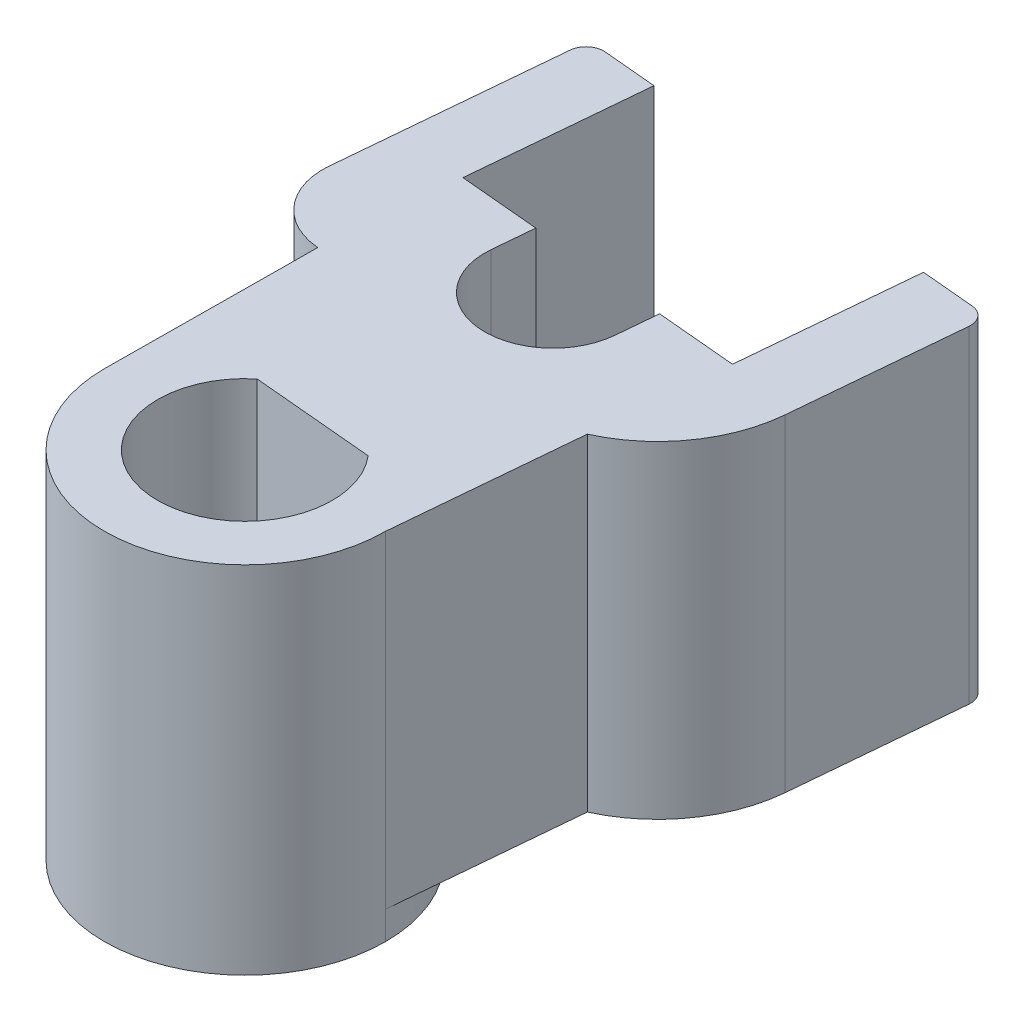
ISO-10303-21;
HEADER;
FILE_DESCRIPTION(('STEP AP214'),'2;1');
FILE_NAME('part.step','',(''),(''),'','','');
FILE_SCHEMA(('AUTOMOTIVE_DESIGN { 1 0 10303 214 1 1 1 1 }'));
ENDSEC;
DATA;
#1=APPLICATION_CONTEXT('core data for automotive mechanical design processes');
#2=APPLICATION_PROTOCOL_DEFINITION('international standard','automotive_design',2000,#1);
#3=PRODUCT_CONTEXT('',#1,'mechanical');
#4=PRODUCT('Part','Part','',(#3));
#5=PRODUCT_RELATED_PRODUCT_CATEGORY('part','',(#4));
#6=PRODUCT_DEFINITION_FORMATION('','',#4);
#7=PRODUCT_DEFINITION_CONTEXT('part definition',#1,'design');
#8=PRODUCT_DEFINITION('design','',#6,#7);
#9=PRODUCT_DEFINITION_SHAPE('','',#8);
#10=(LENGTH_UNIT() NAMED_UNIT(*) SI_UNIT(.MILLI.,.METRE.));
#11=(NAMED_UNIT(*) PLANE_ANGLE_UNIT() SI_UNIT($,.RADIAN.));
#12=(NAMED_UNIT(*) SI_UNIT($,.STERADIAN.) SOLID_ANGLE_UNIT());
#13=UNCERTAINTY_MEASURE_WITH_UNIT(LENGTH_MEASURE(1.E-05),#10,'distance_accuracy_value','');
#14=(GEOMETRIC_REPRESENTATION_CONTEXT(3) GLOBAL_UNCERTAINTY_ASSIGNED_CONTEXT((#13)) GLOBAL_UNIT_ASSIGNED_CONTEXT((#10,
#11,#12)) REPRESENTATION_CONTEXT('',''));
#15=CARTESIAN_POINT('',(0.,0.,0.));
#16=DIRECTION('',(0.,0.,1.));
#17=DIRECTION('',(1.,0.,0.));
#18=AXIS2_PLACEMENT_3D('',#15,#16,#17);
#19=CARTESIAN_POINT('',(0.,0.,0.));
#20=DIRECTION('',(0.,1.,0.));
#21=DIRECTION('',(1.,0.,0.));
#22=AXIS2_PLACEMENT_3D('',#19,#20,#21);
#23=PLANE('',#22);
#24=CARTESIAN_POINT('',(0.,0.,0.));
#25=DIRECTION('',(0.,1.,0.));
#26=DIRECTION('',(-1.,0.,0.));
#27=AXIS2_PLACEMENT_3D('',#24,#25,#26);
#28=CIRCLE('',#27,20.);
#29=CARTESIAN_POINT('',(-20.,0.,0.));
#30=VERTEX_POINT('',#29);
#31=CARTESIAN_POINT('',(20.,0.,0.));
#32=VERTEX_POINT('',#31);
#33=EDGE_CURVE('E62',#30,#32,#28,.T.);
#34=ORIENTED_EDGE('',*,*,#33,.F.);
#35=CARTESIAN_POINT('',(0.,0.,0.));
#36=DIRECTION('',(0.,1.,0.));
#37=DIRECTION('',(1.,0.,0.));
#38=AXIS2_PLACEMENT_3D('',#35,#36,#37);
#39=CIRCLE('',#38,20.);
#40=EDGE_CURVE('E50',#32,#30,#39,.T.);
#41=ORIENTED_EDGE('',*,*,#40,.F.);
#42=EDGE_LOOP('',(#34,#41));
#43=FACE_BOUND('',#42,.T.);
#44=CARTESIAN_POINT('',(0.,0.,0.));
#45=DIRECTION('',(0.,-1.,0.));
#46=DIRECTION('',(0.762382224828731,0.,-0.647126991606126));
#47=AXIS2_PLACEMENT_3D('',#44,#45,#46);
#48=CIRCLE('',#47,12.425);
#49=CARTESIAN_POINT('',(9.472599143497,0.,-8.040552870706));
#50=VERTEX_POINT('',#49);
#51=CARTESIAN_POINT('',(-7.874008605289,0.,-9.611483417446));
#52=VERTEX_POINT('',#51);
#53=EDGE_CURVE('E322',#50,#52,#48,.T.);
#54=ORIENTED_EDGE('',*,*,#53,.F.);
#55=DIRECTION('',(0.995924381742855,0.,0.0901921606910059));
#56=VECTOR('',#55,1.);
#57=CARTESIAN_POINT('',(-7.874008605289,0.,-9.611483417446));
#58=LINE('',#57,#56);
#59=EDGE_CURVE('E333',#52,#50,#58,.T.);
#60=ORIENTED_EDGE('',*,*,#59,.F.);
#61=EDGE_LOOP('',(#54,#60));
#62=FACE_BOUND('',#61,.T.);
#63=ADVANCED_FACE('F39',(#43,#62),#23,.F.);
#64=CARTESIAN_POINT('',(0.,0.,0.));
#65=DIRECTION('',(0.,1.,0.));
#66=DIRECTION('',(1.,0.,0.));
#67=AXIS2_PLACEMENT_3D('',#64,#65,#66);
#68=CYLINDRICAL_SURFACE('',#67,20.);
#69=DIRECTION('',(-1.42108547152E-12,1.,1.509903313491E-11));
#70=VECTOR('',#69,1.);
#71=CARTESIAN_POINT('',(-19.67846218499,3.99,-3.571851905383));
#72=LINE('',#71,#70);
#73=CARTESIAN_POINT('',(-19.67846218499,3.99,-3.571851905383));
#74=VERTEX_POINT('',#73);
#75=CARTESIAN_POINT('',(-19.67846218499,4.,-3.571851905382));
#76=VERTEX_POINT('',#75);
#77=EDGE_CURVE('E11',#74,#76,#72,.T.);
#78=ORIENTED_EDGE('',*,*,#77,.T.);
#79=CARTESIAN_POINT('',(0.,4.,0.));
#80=DIRECTION('',(0.,1.,0.));
#81=DIRECTION('',(1.,0.,0.));
#82=AXIS2_PLACEMENT_3D('',#79,#80,#81);
#83=CIRCLE('',#82,20.);
#84=CARTESIAN_POINT('',(20.,4.,0.));
#85=VERTEX_POINT('',#84);
#86=EDGE_CURVE('E378',#85,#76,#83,.T.);
#87=ORIENTED_EDGE('',*,*,#86,.F.);
#88=DIRECTION('',(0.,1.,0.));
#89=VECTOR('',#88,1.);
#90=CARTESIAN_POINT('',(20.,0.,0.));
#91=LINE('',#90,#89);
#92=EDGE_CURVE('E296',#32,#85,#91,.T.);
#93=ORIENTED_EDGE('',*,*,#92,.F.);
#94=ORIENTED_EDGE('',*,*,#40,.T.);
#95=DIRECTION('',(0.,1.,0.));
#96=VECTOR('',#95,1.);
#97=CARTESIAN_POINT('',(-20.,0.,0.));
#98=LINE('',#97,#96);
#99=CARTESIAN_POINT('',(-20.,50.52,0.));
#100=VERTEX_POINT('',#99);
#101=EDGE_CURVE('E271',#30,#100,#98,.T.);
#102=ORIENTED_EDGE('',*,*,#101,.T.);
#103=CARTESIAN_POINT('',(0.,50.52,0.));
#104=DIRECTION('',(0.,1.,0.));
#105=DIRECTION('',(-0.999859265535129,0.,-0.0167764454981105));
#106=AXIS2_PLACEMENT_3D('',#103,#104,#105);
#107=CIRCLE('',#106,20.);
#108=CARTESIAN_POINT('',(-19.9971853107,50.52,-0.3355289099625));
#109=VERTEX_POINT('',#108);
#110=EDGE_CURVE('E437',#109,#100,#107,.T.);
#111=ORIENTED_EDGE('',*,*,#110,.F.);
#112=DIRECTION('',(0.,1.,0.));
#113=VECTOR('',#112,1.);
#114=CARTESIAN_POINT('',(-19.9971853107,3.99,-0.3355289099629));
#115=LINE('',#114,#113);
#116=CARTESIAN_POINT('',(-19.9971853107,3.99,-0.335528909964));
#117=VERTEX_POINT('',#116);
#118=EDGE_CURVE('E206',#117,#109,#115,.T.);
#119=ORIENTED_EDGE('',*,*,#118,.F.);
#120=CARTESIAN_POINT('',(0.,3.99,0.));
#121=DIRECTION('',(0.,1.,0.));
#122=DIRECTION('',(-0.98392310924942,0.,-0.178592595269104));
#123=AXIS2_PLACEMENT_3D('',#120,#121,#122);
#124=CIRCLE('',#123,20.);
#125=EDGE_CURVE('E199',#74,#117,#124,.T.);
#126=ORIENTED_EDGE('',*,*,#125,.F.);
#127=EDGE_LOOP('',(#78,#87,#93,#94,#102,#111,#119,#126));
#128=FACE_BOUND('',#127,.T.);
#129=ADVANCED_FACE('F504',(#128),#68,.T.);
#130=CARTESIAN_POINT('',(0.,3.99,0.));
#131=DIRECTION('',(0.,1.,0.));
#132=DIRECTION('',(1.,0.,0.));
#133=AXIS2_PLACEMENT_3D('',#130,#131,#132);
#134=PLANE('',#133);
#135=DIRECTION('',(0.0896573776958166,0.,-0.995972667609262));
#136=VECTOR('',#135,1.);
#137=CARTESIAN_POINT('',(-19.67846218499,3.99,-3.571851905383));
#138=LINE('',#137,#136);
#139=CARTESIAN_POINT('',(-15.60744357538,3.99,-48.79538362913));
#140=VERTEX_POINT('',#139);
#141=EDGE_CURVE('E278',#74,#140,#138,.T.);
#142=ORIENTED_EDGE('',*,*,#141,.F.);
#143=ORIENTED_EDGE('',*,*,#125,.T.);
#144=DIRECTION('',(-0.00838851789265115,0.,0.999964815764817));
#145=VECTOR('',#144,1.);
#146=CARTESIAN_POINT('',(-19.74752595585,3.99,-30.09651577054));
#147=LINE('',#146,#145);
#148=CARTESIAN_POINT('',(-19.74752595585,3.99,-30.09651577054));
#149=VERTEX_POINT('',#148);
#150=EDGE_CURVE('E289',#149,#117,#147,.T.);
#151=ORIENTED_EDGE('',*,*,#150,.F.);
#152=DIRECTION('',(0.0901921606910059,0.,-0.995924381742855));
#153=VECTOR('',#152,1.);
#154=CARTESIAN_POINT('',(-19.74752595585,3.99,-30.09651577054));
#155=LINE('',#154,#153);
#156=CARTESIAN_POINT('',(-18.03423013476,3.99,-49.01515646263));
#157=VERTEX_POINT('',#156);
#158=EDGE_CURVE('E340',#149,#157,#155,.T.);
#159=ORIENTED_EDGE('',*,*,#158,.T.);
#160=DIRECTION('',(0.995924381742854,0.,0.0901921606910158));
#161=VECTOR('',#160,1.);
#162=CARTESIAN_POINT('',(-18.03423013476,3.99,-49.01515646263));
#163=LINE('',#162,#161);
#164=EDGE_CURVE('E344',#157,#140,#163,.T.);
#165=ORIENTED_EDGE('',*,*,#164,.T.);
#166=EDGE_LOOP('',(#142,#143,#151,#159,#165));
#167=FACE_BOUND('',#166,.T.);
#168=ADVANCED_FACE('F604',(#167),#134,.F.);
#169=CARTESIAN_POINT('',(-19.58764088762,200.52,-49.15583528806));
#170=DIRECTION('',(-0.0901921606910059,0.,0.995924381742855));
#171=DIRECTION('',(0.,1.,0.));
#172=AXIS2_PLACEMENT_3D('',#169,#170,#171);
#173=PLANE('',#172);
#174=DIRECTION('',(0.995924381742855,0.,0.0901921606910059));
#175=VECTOR('',#174,1.);
#176=CARTESIAN_POINT('',(-18.03423013476,50.52,-49.01515646263));
#177=LINE('',#176,#175);
#178=CARTESIAN_POINT('',(-18.03423013476,50.52,-49.01515646263));
#179=VERTEX_POINT('',#178);
#180=CARTESIAN_POINT('',(-6.645483010103,50.52,-47.98377724392));
#181=VERTEX_POINT('',#180);
#182=EDGE_CURVE('E287',#179,#181,#177,.T.);
#183=ORIENTED_EDGE('',*,*,#182,.T.);
#184=DIRECTION('',(0.,-1.,0.));
#185=VECTOR('',#184,1.);
#186=CARTESIAN_POINT('',(-6.645483010103,50.52,-47.98377724392));
#187=LINE('',#186,#185);
#188=CARTESIAN_POINT('',(-6.645483010103,4.,-47.98377724392));
#189=VERTEX_POINT('',#188);
#190=EDGE_CURVE('E283',#181,#189,#187,.T.);
#191=ORIENTED_EDGE('',*,*,#190,.T.);
#192=DIRECTION('',(0.995924381742855,0.,0.0901921606910059));
#193=VECTOR('',#192,1.);
#194=CARTESIAN_POINT('',(-15.60744357538,4.,-48.79538362913));
#195=LINE('',#194,#193);
#196=CARTESIAN_POINT('',(-15.60744357538,4.,-48.79538362913));
#197=VERTEX_POINT('',#196);
#198=EDGE_CURVE('E421',#197,#189,#195,.T.);
#199=ORIENTED_EDGE('',*,*,#198,.F.);
#200=DIRECTION('',(0.,-1.,0.));
#201=VECTOR('',#200,1.);
#202=CARTESIAN_POINT('',(-15.60744357538,4.,-48.79538362913));
#203=LINE('',#202,#201);
#204=EDGE_CURVE('E288',#197,#140,#203,.T.);
#205=ORIENTED_EDGE('',*,*,#204,.T.);
#206=ORIENTED_EDGE('',*,*,#164,.F.);
#207=DIRECTION('',(0.,-1.,0.));
#208=VECTOR('',#207,1.);
#209=CARTESIAN_POINT('',(-18.03423013476,4.,-49.01515646263));
#210=LINE('',#209,#208);
#211=CARTESIAN_POINT('',(-18.03423013476,4.,-49.01515646263));
#212=VERTEX_POINT('',#211);
#213=EDGE_CURVE('E353',#212,#157,#210,.T.);
#214=ORIENTED_EDGE('',*,*,#213,.F.);
#215=DIRECTION('',(0.,-1.,0.));
#216=VECTOR('',#215,1.);
#217=CARTESIAN_POINT('',(-18.03423013476,50.52,-49.01515646263));
#218=LINE('',#217,#216);
#219=EDGE_CURVE('E345',#179,#212,#218,.T.);
#220=ORIENTED_EDGE('',*,*,#219,.F.);
#221=EDGE_LOOP('',(#183,#191,#199,#205,#206,#214,#220));
#222=FACE_BOUND('',#221,.T.);
#223=ADVANCED_FACE('F636',(#222),#173,.F.);
#224=CARTESIAN_POINT('',(-19.58764088762,200.52,-49.15583528806));
#225=DIRECTION('',(-0.0901921606910059,0.,0.995924381742855));
#226=DIRECTION('',(0.,1.,0.));
#227=AXIS2_PLACEMENT_3D('',#224,#225,#226);
#228=PLANE('',#227);
#229=DIRECTION('',(0.995924381742855,0.,0.0901921606910059));
#230=VECTOR('',#229,1.);
#231=CARTESIAN_POINT('',(12.7046240883,4.,-46.23140728411));
#232=LINE('',#231,#230);
#233=CARTESIAN_POINT('',(12.7046240883,4.,-46.23140728411));
#234=VERTEX_POINT('',#233);
#235=CARTESIAN_POINT('',(24.09337121296,4.,-45.2000280654));
#236=VERTEX_POINT('',#235);
#237=EDGE_CURVE('E247',#234,#236,#232,.T.);
#238=ORIENTED_EDGE('',*,*,#237,.F.);
#239=DIRECTION('',(0.,-1.,0.));
#240=VECTOR('',#239,1.);
#241=CARTESIAN_POINT('',(12.7046240883,50.52,-46.23140728411));
#242=LINE('',#241,#240);
#243=CARTESIAN_POINT('',(12.7046240883,50.52,-46.23140728411));
#244=VERTEX_POINT('',#243);
#245=EDGE_CURVE('E232',#244,#234,#242,.T.);
#246=ORIENTED_EDGE('',*,*,#245,.F.);
#247=DIRECTION('',(0.995924381742855,0.,0.0901921606910059));
#248=VECTOR('',#247,1.);
#249=CARTESIAN_POINT('',(12.7046240883,50.52,-46.23140728411));
#250=LINE('',#249,#248);
#251=CARTESIAN_POINT('',(24.09337121296,50.52,-45.2000280654));
#252=VERTEX_POINT('',#251);
#253=EDGE_CURVE('E381',#244,#252,#250,.T.);
#254=ORIENTED_EDGE('',*,*,#253,.T.);
#255=DIRECTION('',(0.,-1.,0.));
#256=VECTOR('',#255,1.);
#257=CARTESIAN_POINT('',(24.09337121296,50.52,-45.2000280654));
#258=LINE('',#257,#256);
#259=EDGE_CURVE('E249',#252,#236,#258,.T.);
#260=ORIENTED_EDGE('',*,*,#259,.T.);
#261=EDGE_LOOP('',(#238,#246,#254,#260));
#262=FACE_BOUND('',#261,.T.);
#263=ADVANCED_FACE('F248',(#262),#228,.F.);
#264=CARTESIAN_POINT('',(-16.30073077987,4.,-68.15688962486));
#265=DIRECTION('',(0.995924381742855,0.,0.0901921606910059));
#266=DIRECTION('',(0.,-1.,0.));
#267=AXIS2_PLACEMENT_3D('',#264,#265,#266);
#268=PLANE('',#267);
#269=DIRECTION('',(-0.0901921606910059,0.,0.995924381742855));
#270=VECTOR('',#269,1.);
#271=CARTESIAN_POINT('',(-16.30073077987,4.,-68.15688962486));
#272=LINE('',#271,#270);
#273=CARTESIAN_POINT('',(-15.7794261174871,4.,-73.9132660062016));
#274=VERTEX_POINT('',#273);
#275=EDGE_CURVE('E362',#274,#212,#272,.T.);
#276=ORIENTED_EDGE('',*,*,#275,.F.);
#277=DIRECTION('',(0.,-1.,0.));
#278=VECTOR('',#277,1.);
#279=CARTESIAN_POINT('',(-15.7794261174871,79.0492360361072,-73.9132660062016));
#280=LINE('',#279,#278);
#281=CARTESIAN_POINT('',(-15.7794261174871,50.52,-73.9132660062016));
#282=VERTEX_POINT('',#281);
#283=EDGE_CURVE('E282',#282,#274,#280,.T.);
#284=ORIENTED_EDGE('',*,*,#283,.F.);
#285=DIRECTION('',(-0.0901921606910059,0.,0.995924381742855));
#286=VECTOR('',#285,1.);
#287=CARTESIAN_POINT('',(-16.30073077987,50.52,-68.15688962486));
#288=LINE('',#287,#286);
#289=EDGE_CURVE('E348',#282,#179,#288,.T.);
#290=ORIENTED_EDGE('',*,*,#289,.T.);
#291=ORIENTED_EDGE('',*,*,#219,.T.);
#292=EDGE_LOOP('',(#276,#284,#290,#291));
#293=FACE_BOUND('',#292,.T.);
#294=ADVANCED_FACE('F615',(#293),#268,.T.);
#295=CARTESIAN_POINT('',(0.,50.52,0.));
#296=DIRECTION('',(0.,1.,0.));
#297=DIRECTION('',(1.,0.,0.));
#298=AXIS2_PLACEMENT_3D('',#295,#296,#297);
#299=PLANE('',#298);
#300=CARTESIAN_POINT('',(14.14012742753,50.52,-44.50508780831));
#301=DIRECTION('',(0.,1.,0.));
#302=DIRECTION('',(0.411997398217113,0.,0.911185021750429));
#303=AXIS2_PLACEMENT_3D('',#300,#301,#302);
#304=CIRCLE('',#303,20.);
#305=CARTESIAN_POINT('',(22.38007539188,50.52,-26.28138737331));
#306=VERTEX_POINT('',#305);
#307=CARTESIAN_POINT('',(34.05861506239,50.52,-42.70124459449));
#308=VERTEX_POINT('',#307);
#309=EDGE_CURVE('E415',#306,#308,#304,.T.);
#310=ORIENTED_EDGE('',*,*,#309,.T.);
#311=DIRECTION('',(-0.0901921606910059,0.,0.995924381742855));
#312=VECTOR('',#311,1.);
#313=CARTESIAN_POINT('',(35.25906183736,50.52,-55.95687793355));
#314=LINE('',#313,#312);
#315=CARTESIAN_POINT('',(36.2313273031977,50.52,-66.6928762236008));
#316=VERTEX_POINT('',#315);
#317=EDGE_CURVE('E43',#316,#308,#314,.T.);
#318=ORIENTED_EDGE('',*,*,#317,.F.);
#319=CARTESIAN_POINT('',(33.7415163488405,50.52,-66.9183566253282));
#320=DIRECTION('',(0.,1.,0.));
#321=DIRECTION('',(0.,0.,1.));
#322=AXIS2_PLACEMENT_3D('',#319,#320,#321);
#323=CIRCLE('',#322,2.5);
#324=CARTESIAN_POINT('',(33.966996750568,50.52,-69.4081675796854));
#325=VERTEX_POINT('',#324);
#326=EDGE_CURVE('E548',#325,#316,#323,.F.);
#327=ORIENTED_EDGE('',*,*,#326,.F.);
#328=DIRECTION('',(0.995924381742857,0.,0.0901921606909796));
#329=VECTOR('',#328,1.);
#330=CARTESIAN_POINT('',(26.3481752302329,50.52,-70.0981376089716));
#331=LINE('',#330,#329);
#332=CARTESIAN_POINT('',(26.3481752302329,50.52,-70.0981376089716));
#333=VERTEX_POINT('',#332);
#334=EDGE_CURVE('E543',#333,#325,#331,.T.);
#335=ORIENTED_EDGE('',*,*,#334,.F.);
#336=DIRECTION('',(0.0901921606910059,0.,-0.995924381742855));
#337=VECTOR('',#336,1.);
#338=CARTESIAN_POINT('',(24.09337121296,50.52,-45.2000280654));
#339=LINE('',#338,#337);
#340=EDGE_CURVE('E405',#252,#333,#339,.T.);
#341=ORIENTED_EDGE('',*,*,#340,.F.);
#342=ORIENTED_EDGE('',*,*,#253,.F.);
#343=DIRECTION('',(0.0901921606910059,0.,-0.995924381742855));
#344=VECTOR('',#343,1.);
#345=CARTESIAN_POINT('',(12.17758191751,50.52,-40.41167590085));
#346=LINE('',#345,#344);
#347=CARTESIAN_POINT('',(12.17758191751,50.52,-40.41167590085));
#348=VERTEX_POINT('',#347);
#349=EDGE_CURVE('E239',#348,#244,#346,.T.);
#350=ORIENTED_EDGE('',*,*,#349,.F.);
#351=CARTESIAN_POINT('',(2.502528368309,50.52,-41.28786088076));
#352=DIRECTION('',(0.,1.,0.));
#353=DIRECTION('',(-0.995924381742854,0.,-0.0901921606910158));
#354=AXIS2_PLACEMENT_3D('',#351,#352,#353);
#355=CIRCLE('',#354,9.714646740822);
#356=CARTESIAN_POINT('',(-7.172525180893,50.52,-42.16404586066));
#357=VERTEX_POINT('',#356);
#358=EDGE_CURVE('E160',#357,#348,#355,.T.);
#359=ORIENTED_EDGE('',*,*,#358,.F.);
#360=DIRECTION('',(-0.0901921606910059,0.,0.995924381742855));
#361=VECTOR('',#360,1.);
#362=CARTESIAN_POINT('',(-6.645483010103,50.52,-47.98377724392));
#363=LINE('',#362,#361);
#364=EDGE_CURVE('E172',#181,#357,#363,.T.);
#365=ORIENTED_EDGE('',*,*,#364,.F.);
#366=ORIENTED_EDGE('',*,*,#182,.F.);
#367=ORIENTED_EDGE('',*,*,#289,.F.);
#368=DIRECTION('',(0.995924381742863,0.,0.0901921606909153));
#369=VECTOR('',#368,1.);
#370=CARTESIAN_POINT('',(-15.7794261174871,50.52,-73.9132660062016));
#371=LINE('',#370,#369);
#372=CARTESIAN_POINT('',(-23.4028511523983,50.52,-74.6036529355391));
#373=VERTEX_POINT('',#372);
#374=EDGE_CURVE('E529',#373,#282,#371,.T.);
#375=ORIENTED_EDGE('',*,*,#374,.F.);
#376=CARTESIAN_POINT('',(-23.6283315541256,50.52,-72.113841981182));
#377=DIRECTION('',(0.,1.,0.));
#378=DIRECTION('',(0.,0.,1.));
#379=AXIS2_PLACEMENT_3D('',#376,#377,#378);
#380=CIRCLE('',#379,2.5);
#381=CARTESIAN_POINT('',(-26.1181425084827,50.52,-72.3393223829091));
#382=VERTEX_POINT('',#381);
#383=EDGE_CURVE('E524',#382,#373,#380,.F.);
#384=ORIENTED_EDGE('',*,*,#383,.F.);
#385=DIRECTION('',(-0.0901921606910059,0.,0.995924381742855));
#386=VECTOR('',#385,1.);
#387=CARTESIAN_POINT('',(-27.09040797432,50.52,-61.60332409286));
#388=LINE('',#387,#386);
#389=CARTESIAN_POINT('',(-28.9588403382,50.52,-40.97162691903));
#390=VERTEX_POINT('',#389);
#391=EDGE_CURVE('E325',#382,#390,#388,.T.);
#392=ORIENTED_EDGE('',*,*,#391,.T.);
#393=CARTESIAN_POINT('',(-18.99959652078,50.52,-40.06970531212));
#394=DIRECTION('',(0.,1.,0.));
#395=DIRECTION('',(-0.995924381742855,0.,-0.0901921606910059));
#396=AXIS2_PLACEMENT_3D('',#393,#394,#395);
#397=CIRCLE('',#396,10.);
#398=CARTESIAN_POINT('',(-19.90151812769,50.52,-30.11046149469));
#399=VERTEX_POINT('',#398);
#400=EDGE_CURVE('E276',#390,#399,#397,.T.);
#401=ORIENTED_EDGE('',*,*,#400,.T.);
#402=DIRECTION('',(-0.995924381742854,0.,-0.0901921606910158));
#403=VECTOR('',#402,1.);
#404=CARTESIAN_POINT('',(-19.74752595585,50.52,-30.09651577054));
#405=LINE('',#404,#403);
#406=CARTESIAN_POINT('',(-19.74752595585,50.52,-30.09651577054));
#407=VERTEX_POINT('',#406);
#408=EDGE_CURVE('E409',#407,#399,#405,.T.);
#409=ORIENTED_EDGE('',*,*,#408,.F.);
#410=DIRECTION('',(-0.00838851789265115,0.,0.999964815764817));
#411=VECTOR('',#410,1.);
#412=CARTESIAN_POINT('',(-19.74752595585,50.52,-30.09651577054));
#413=LINE('',#412,#411);
#414=EDGE_CURVE('E349',#407,#109,#413,.T.);
#415=ORIENTED_EDGE('',*,*,#414,.T.);
#416=ORIENTED_EDGE('',*,*,#110,.T.);
#417=CARTESIAN_POINT('',(0.,50.52,0.));
#418=DIRECTION('',(0.,1.,0.));
#419=DIRECTION('',(-1.,0.,0.));
#420=AXIS2_PLACEMENT_3D('',#417,#418,#419);
#421=CIRCLE('',#420,20.);
#422=CARTESIAN_POINT('',(20.,50.52,0.));
#423=VERTEX_POINT('',#422);
#424=EDGE_CURVE('E427',#100,#423,#421,.T.);
#425=ORIENTED_EDGE('',*,*,#424,.T.);
#426=DIRECTION('',(-0.0901921606910059,0.,0.995924381742855));
#427=VECTOR('',#426,1.);
#428=CARTESIAN_POINT('',(22.38007539188,50.52,-26.28138737331));
#429=LINE('',#428,#427);
#430=EDGE_CURVE('E402',#306,#423,#429,.T.);
#431=ORIENTED_EDGE('',*,*,#430,.F.);
#432=EDGE_LOOP('',(#310,#318,#327,#335,#341,#342,#350,#359,#365,#366,#367,#375,#384,#392,#401,
#409,#415,#416,#425,#431));
#433=FACE_BOUND('',#432,.T.);
#434=CARTESIAN_POINT('',(0.,50.52,0.));
#435=DIRECTION('',(0.,-1.,0.));
#436=DIRECTION('',(0.762382224828731,0.,-0.647126991606126));
#437=AXIS2_PLACEMENT_3D('',#434,#435,#436);
#438=CIRCLE('',#437,12.425);
#439=CARTESIAN_POINT('',(9.472599143497,50.52,-8.040552870706));
#440=VERTEX_POINT('',#439);
#441=CARTESIAN_POINT('',(-7.874008605289,50.52,-9.611483417446));
#442=VERTEX_POINT('',#441);
#443=EDGE_CURVE('E272',#440,#442,#438,.T.);
#444=ORIENTED_EDGE('',*,*,#443,.T.);
#445=DIRECTION('',(0.995924381742855,0.,0.0901921606910059));
#446=VECTOR('',#445,1.);
#447=CARTESIAN_POINT('',(-7.874008605289,50.52,-9.611483417446));
#448=LINE('',#447,#446);
#449=EDGE_CURVE('E277',#442,#440,#448,.T.);
#450=ORIENTED_EDGE('',*,*,#449,.T.);
#451=EDGE_LOOP('',(#444,#450));
#452=FACE_BOUND('',#451,.T.);
#453=ADVANCED_FACE('F489',(#433,#452),#299,.T.);
#454=CARTESIAN_POINT('',(-7.874008605289,0.,-9.611483417446));
#455=DIRECTION('',(-0.0901921606910059,0.,0.995924381742855));
#456=DIRECTION('',(0.,1.,0.));
#457=AXIS2_PLACEMENT_3D('',#454,#455,#456);
#458=PLANE('',#457);
#459=DIRECTION('',(0.,1.,0.));
#460=VECTOR('',#459,1.);
#461=CARTESIAN_POINT('',(9.472599143497,0.,-8.040552870706));
#462=LINE('',#461,#460);
#463=EDGE_CURVE('E394',#50,#440,#462,.T.);
#464=ORIENTED_EDGE('',*,*,#463,.T.);
#465=ORIENTED_EDGE('',*,*,#449,.F.);
#466=DIRECTION('',(0.,1.,0.));
#467=VECTOR('',#466,1.);
#468=CARTESIAN_POINT('',(-7.874008605289,0.,-9.611483417446));
#469=LINE('',#468,#467);
#470=EDGE_CURVE('E329',#52,#442,#469,.T.);
#471=ORIENTED_EDGE('',*,*,#470,.F.);
#472=ORIENTED_EDGE('',*,*,#59,.T.);
#473=EDGE_LOOP('',(#464,#465,#471,#472));
#474=FACE_BOUND('',#473,.T.);
#475=ADVANCED_FACE('F592',(#474),#458,.T.);
#476=CARTESIAN_POINT('',(0.,0.,0.));
#477=DIRECTION('',(0.,1.,0.));
#478=DIRECTION('',(1.,0.,0.));
#479=AXIS2_PLACEMENT_3D('',#476,#477,#478);
#480=CYLINDRICAL_SURFACE('',#479,12.425);
#481=ORIENTED_EDGE('',*,*,#470,.T.);
#482=ORIENTED_EDGE('',*,*,#443,.F.);
#483=ORIENTED_EDGE('',*,*,#463,.F.);
#484=ORIENTED_EDGE('',*,*,#53,.T.);
#485=EDGE_LOOP('',(#481,#482,#483,#484));
#486=FACE_BOUND('',#485,.T.);
#487=ADVANCED_FACE('F596',(#486),#480,.F.);
#488=CARTESIAN_POINT('',(-18.99959652078,-65.857872,-40.06970531212));
#489=DIRECTION('',(0.,1.,0.));
#490=DIRECTION('',(-0.995924381742855,0.,-0.0901921606910059));
#491=AXIS2_PLACEMENT_3D('',#488,#489,#490);
#492=CYLINDRICAL_SURFACE('',#491,10.);
#493=DIRECTION('',(0.,1.,0.));
#494=VECTOR('',#493,1.);
#495=CARTESIAN_POINT('',(-28.9588403382,4.,-40.97162691903));
#496=LINE('',#495,#494);
#497=CARTESIAN_POINT('',(-28.9588403382,4.,-40.97162691903));
#498=VERTEX_POINT('',#497);
#499=EDGE_CURVE('E309',#498,#390,#496,.T.);
#500=ORIENTED_EDGE('',*,*,#499,.F.);
#501=CARTESIAN_POINT('',(-18.99959652078,4.,-40.06970531212));
#502=DIRECTION('',(0.,-1.,0.));
#503=DIRECTION('',(-0.0901921606910059,0.,0.995924381742855));
#504=AXIS2_PLACEMENT_3D('',#501,#502,#503);
#505=CIRCLE('',#504,10.);
#506=CARTESIAN_POINT('',(-19.90151812769,4.,-30.11046149469));
#507=VERTEX_POINT('',#506);
#508=EDGE_CURVE('E339',#507,#498,#505,.T.);
#509=ORIENTED_EDGE('',*,*,#508,.F.);
#510=DIRECTION('',(0.,1.,0.));
#511=VECTOR('',#510,1.);
#512=CARTESIAN_POINT('',(-19.90151812769,4.,-30.11046149469));
#513=LINE('',#512,#511);
#514=EDGE_CURVE('E424',#507,#399,#513,.T.);
#515=ORIENTED_EDGE('',*,*,#514,.T.);
#516=ORIENTED_EDGE('',*,*,#400,.F.);
#517=EDGE_LOOP('',(#500,#509,#515,#516));
#518=FACE_BOUND('',#517,.T.);
#519=ADVANCED_FACE('F41',(#518),#492,.T.);
#520=CARTESIAN_POINT('',(-19.74752595585,4.,-30.09651577054));
#521=DIRECTION('',(-0.0901921606910059,0.,0.995924381742855));
#522=DIRECTION('',(0.,1.,0.));
#523=AXIS2_PLACEMENT_3D('',#520,#521,#522);
#524=PLANE('',#523);
#525=DIRECTION('',(-0.995924381742849,0.,-0.0901921606910744));
#526=VECTOR('',#525,1.);
#527=CARTESIAN_POINT('',(-19.74752595585,4.,-30.09651577054));
#528=LINE('',#527,#526);
#529=CARTESIAN_POINT('',(-19.74752595585,4.,-30.09651577054));
#530=VERTEX_POINT('',#529);
#531=EDGE_CURVE('E334',#530,#507,#528,.T.);
#532=ORIENTED_EDGE('',*,*,#531,.F.);
#533=DIRECTION('',(0.,-1.,0.));
#534=VECTOR('',#533,1.);
#535=CARTESIAN_POINT('',(-19.74752595585,50.52,-30.09651577054));
#536=LINE('',#535,#534);
#537=EDGE_CURVE('E350',#407,#530,#536,.T.);
#538=ORIENTED_EDGE('',*,*,#537,.F.);
#539=ORIENTED_EDGE('',*,*,#408,.T.);
#540=ORIENTED_EDGE('',*,*,#514,.F.);
#541=EDGE_LOOP('',(#532,#538,#539,#540));
#542=FACE_BOUND('',#541,.T.);
#543=ADVANCED_FACE('F614',(#542),#524,.T.);
#544=CARTESIAN_POINT('',(-19.74752595585,50.52,-30.09651577054));
#545=DIRECTION('',(-0.999964815764817,0.,-0.00838851789265114));
#546=DIRECTION('',(-0.00838851789265114,0.,0.999964815764817));
#547=AXIS2_PLACEMENT_3D('',#544,#545,#546);
#548=PLANE('',#547);
#549=DIRECTION('',(0.,-1.,-2.131628207281E-12));
#550=VECTOR('',#549,1.);
#551=CARTESIAN_POINT('',(-19.74752595585,4.,-30.09651577054));
#552=LINE('',#551,#550);
#553=EDGE_CURVE('E292',#530,#149,#552,.T.);
#554=ORIENTED_EDGE('',*,*,#553,.T.);
#555=ORIENTED_EDGE('',*,*,#150,.T.);
#556=ORIENTED_EDGE('',*,*,#118,.T.);
#557=ORIENTED_EDGE('',*,*,#414,.F.);
#558=ORIENTED_EDGE('',*,*,#537,.T.);
#559=EDGE_LOOP('',(#554,#555,#556,#557,#558));
#560=FACE_BOUND('',#559,.T.);
#561=ADVANCED_FACE('F610',(#560),#548,.T.);
#562=CARTESIAN_POINT('',(-8.771175896348,50.52,-151.3001166494));
#563=DIRECTION('',(-0.995924381742855,0.,-0.0901921606910059));
#564=DIRECTION('',(-0.0901921606910059,0.,0.995924381742855));
#565=AXIS2_PLACEMENT_3D('',#562,#563,#564);
#566=PLANE('',#565);
#567=ORIENTED_EDGE('',*,*,#213,.T.);
#568=ORIENTED_EDGE('',*,*,#158,.F.);
#569=ORIENTED_EDGE('',*,*,#553,.F.);
#570=DIRECTION('',(-0.0901921606910059,0.,0.995924381742855));
#571=VECTOR('',#570,1.);
#572=CARTESIAN_POINT('',(-18.03423013476,4.,-49.01515646263));
#573=LINE('',#572,#571);
#574=EDGE_CURVE('E338',#212,#530,#573,.T.);
#575=ORIENTED_EDGE('',*,*,#574,.F.);
#576=EDGE_LOOP('',(#567,#568,#569,#575));
#577=FACE_BOUND('',#576,.T.);
#578=ADVANCED_FACE('F613',(#577),#566,.T.);
#579=CARTESIAN_POINT('',(0.,4.,0.));
#580=DIRECTION('',(0.,-1.,0.));
#581=DIRECTION('',(0.,0.,-1.));
#582=AXIS2_PLACEMENT_3D('',#579,#580,#581);
#583=PLANE('',#582);
#584=DIRECTION('',(0.0901921606910059,0.,-0.995924381742855));
#585=VECTOR('',#584,1.);
#586=CARTESIAN_POINT('',(-28.9588403382,4.,-40.97162691903));
#587=LINE('',#586,#585);
#588=CARTESIAN_POINT('',(-26.1181425084827,4.,-72.3393223829091));
#589=VERTEX_POINT('',#588);
#590=EDGE_CURVE('E391',#498,#589,#587,.T.);
#591=ORIENTED_EDGE('',*,*,#590,.T.);
#592=CARTESIAN_POINT('',(-23.6283315541256,4.,-72.113841981182));
#593=DIRECTION('',(0.,-1.,0.));
#594=DIRECTION('',(0.,0.,1.));
#595=AXIS2_PLACEMENT_3D('',#592,#593,#594);
#596=CIRCLE('',#595,2.5);
#597=CARTESIAN_POINT('',(-23.4028511523983,4.,-74.6036529355391));
#598=VERTEX_POINT('',#597);
#599=EDGE_CURVE('E536',#589,#598,#596,.T.);
#600=ORIENTED_EDGE('',*,*,#599,.T.);
#601=DIRECTION('',(0.995924381742863,0.,0.0901921606909153));
#602=VECTOR('',#601,1.);
#603=CARTESIAN_POINT('',(-15.7794261174871,4.,-73.9132660062016));
#604=LINE('',#603,#602);
#605=EDGE_CURVE('E525',#598,#274,#604,.T.);
#606=ORIENTED_EDGE('',*,*,#605,.T.);
#607=ORIENTED_EDGE('',*,*,#275,.T.);
#608=ORIENTED_EDGE('',*,*,#574,.T.);
#609=ORIENTED_EDGE('',*,*,#531,.T.);
#610=ORIENTED_EDGE('',*,*,#508,.T.);
#611=EDGE_LOOP('',(#591,#600,#606,#607,#608,#609,#610));
#612=FACE_BOUND('',#611,.T.);
#613=ADVANCED_FACE('F644',(#612),#583,.T.);
#614=CARTESIAN_POINT('',(0.,4.,0.));
#615=DIRECTION('',(0.,-1.,0.));
#616=DIRECTION('',(0.,0.,-1.));
#617=AXIS2_PLACEMENT_3D('',#614,#615,#616);
#618=PLANE('',#617);
#619=ORIENTED_EDGE('',*,*,#237,.T.);
#620=DIRECTION('',(0.0901921606910059,0.,-0.995924381742855));
#621=VECTOR('',#620,1.);
#622=CARTESIAN_POINT('',(24.09337121296,4.,-45.2000280654));
#623=LINE('',#622,#621);
#624=CARTESIAN_POINT('',(26.3481752302329,4.,-70.0981376089716));
#625=VERTEX_POINT('',#624);
#626=EDGE_CURVE('E254',#236,#625,#623,.T.);
#627=ORIENTED_EDGE('',*,*,#626,.T.);
#628=DIRECTION('',(0.995924381742857,0.,0.0901921606909796));
#629=VECTOR('',#628,1.);
#630=CARTESIAN_POINT('',(26.3481752302329,4.,-70.0981376089716));
#631=LINE('',#630,#629);
#632=CARTESIAN_POINT('',(33.966996750568,4.,-69.4081675796854));
#633=VERTEX_POINT('',#632);
#634=EDGE_CURVE('E553',#625,#633,#631,.T.);
#635=ORIENTED_EDGE('',*,*,#634,.T.);
#636=CARTESIAN_POINT('',(33.7415163488405,4.,-66.9183566253282));
#637=DIRECTION('',(0.,-1.,0.));
#638=DIRECTION('',(0.,0.,-1.));
#639=AXIS2_PLACEMENT_3D('',#636,#637,#638);
#640=CIRCLE('',#639,2.5);
#641=CARTESIAN_POINT('',(36.2313273031977,4.,-66.6928762236008));
#642=VERTEX_POINT('',#641);
#643=EDGE_CURVE('E544',#633,#642,#640,.T.);
#644=ORIENTED_EDGE('',*,*,#643,.T.);
#645=DIRECTION('',(-0.0901921606910059,0.,0.995924381742855));
#646=VECTOR('',#645,1.);
#647=CARTESIAN_POINT('',(35.25906183736,4.,-55.95687793355));
#648=LINE('',#647,#646);
#649=CARTESIAN_POINT('',(34.05861506239,4.,-42.70124459449));
#650=VERTEX_POINT('',#649);
#651=EDGE_CURVE('E297',#642,#650,#648,.T.);
#652=ORIENTED_EDGE('',*,*,#651,.T.);
#653=CARTESIAN_POINT('',(14.14012742753,4.,-44.50508780831));
#654=DIRECTION('',(0.,-1.,0.));
#655=DIRECTION('',(0.995924381742855,0.,0.0901921606910059));
#656=AXIS2_PLACEMENT_3D('',#653,#654,#655);
#657=CIRCLE('',#656,20.);
#658=CARTESIAN_POINT('',(22.38007539188,4.,-26.28138737331));
#659=VERTEX_POINT('',#658);
#660=EDGE_CURVE('E299',#650,#659,#657,.T.);
#661=ORIENTED_EDGE('',*,*,#660,.T.);
#662=DIRECTION('',(-0.0901921606910059,0.,0.995924381742855));
#663=VECTOR('',#662,1.);
#664=CARTESIAN_POINT('',(22.38007539188,4.,-26.28138737331));
#665=LINE('',#664,#663);
#666=EDGE_CURVE('E380',#659,#85,#665,.T.);
#667=ORIENTED_EDGE('',*,*,#666,.T.);
#668=ORIENTED_EDGE('',*,*,#86,.T.);
#669=DIRECTION('',(0.0896573776958166,0.,-0.995972667609262));
#670=VECTOR('',#669,1.);
#671=CARTESIAN_POINT('',(-19.67846218499,4.,-3.571851905382));
#672=LINE('',#671,#670);
#673=EDGE_CURVE('E376',#76,#197,#672,.T.);
#674=ORIENTED_EDGE('',*,*,#673,.T.);
#675=ORIENTED_EDGE('',*,*,#198,.T.);
#676=DIRECTION('',(-0.0901921606910059,0.,0.995924381742855));
#677=VECTOR('',#676,1.);
#678=CARTESIAN_POINT('',(-6.645483010103,4.,-47.98377724392));
#679=LINE('',#678,#677);
#680=CARTESIAN_POINT('',(-7.172525180893,4.,-42.16404586066));
#681=VERTEX_POINT('',#680);
#682=EDGE_CURVE('E265',#189,#681,#679,.T.);
#683=ORIENTED_EDGE('',*,*,#682,.T.);
#684=CARTESIAN_POINT('',(2.502528368309,4.,-41.28786088076));
#685=DIRECTION('',(0.,1.,0.));
#686=DIRECTION('',(-0.995924381742854,0.,-0.0901921606910158));
#687=AXIS2_PLACEMENT_3D('',#684,#685,#686);
#688=CIRCLE('',#687,9.714646740822);
#689=CARTESIAN_POINT('',(12.17758191751,4.,-40.41167590085));
#690=VERTEX_POINT('',#689);
#691=EDGE_CURVE('E258',#681,#690,#688,.T.);
#692=ORIENTED_EDGE('',*,*,#691,.T.);
#693=DIRECTION('',(0.0901921606910059,0.,-0.995924381742855));
#694=VECTOR('',#693,1.);
#695=CARTESIAN_POINT('',(12.17758191751,4.,-40.41167590085));
#696=LINE('',#695,#694);
#697=EDGE_CURVE('E237',#690,#234,#696,.T.);
#698=ORIENTED_EDGE('',*,*,#697,.T.);
#699=EDGE_LOOP('',(#619,#627,#635,#644,#652,#661,#667,#668,#674,#675,#683,#692,#698));
#700=FACE_BOUND('',#699,.T.);
#701=ADVANCED_FACE('F256',(#700),#618,.T.);
#702=CARTESIAN_POINT('',(-29.86076194511,4.,-31.0123831016));
#703=DIRECTION('',(-0.995924381742855,0.,-0.0901921606910059));
#704=DIRECTION('',(-0.0901921606910059,0.,0.995924381742855));
#705=AXIS2_PLACEMENT_3D('',#702,#703,#704);
#706=PLANE('',#705);
#707=ORIENTED_EDGE('',*,*,#499,.T.);
#708=ORIENTED_EDGE('',*,*,#391,.F.);
#709=DIRECTION('',(0.,-1.,0.));
#710=VECTOR('',#709,1.);
#711=CARTESIAN_POINT('',(-26.1181425084827,79.0492360361072,-72.3393223829091));
#712=LINE('',#711,#710);
#713=EDGE_CURVE('E521',#382,#589,#712,.T.);
#714=ORIENTED_EDGE('',*,*,#713,.T.);
#715=ORIENTED_EDGE('',*,*,#590,.F.);
#716=EDGE_LOOP('',(#707,#708,#714,#715));
#717=FACE_BOUND('',#716,.T.);
#718=ADVANCED_FACE('F624',(#717),#706,.T.);
#719=CARTESIAN_POINT('',(14.14012742753,-66.01283973791,-44.50508780831));
#720=DIRECTION('',(0.,1.,0.));
#721=DIRECTION('',(0.411997398217113,0.,0.911185021750429));
#722=AXIS2_PLACEMENT_3D('',#719,#720,#721);
#723=CYLINDRICAL_SURFACE('',#722,20.);
#724=DIRECTION('',(0.,1.,0.));
#725=VECTOR('',#724,1.);
#726=CARTESIAN_POINT('',(22.38007539188,4.,-26.28138737331));
#727=LINE('',#726,#725);
#728=EDGE_CURVE('E406',#659,#306,#727,.T.);
#729=ORIENTED_EDGE('',*,*,#728,.F.);
#730=ORIENTED_EDGE('',*,*,#660,.F.);
#731=DIRECTION('',(0.,1.,0.));
#732=VECTOR('',#731,1.);
#733=CARTESIAN_POINT('',(34.05861506239,4.,-42.70124459449));
#734=LINE('',#733,#732);
#735=EDGE_CURVE('E318',#650,#308,#734,.T.);
#736=ORIENTED_EDGE('',*,*,#735,.T.);
#737=ORIENTED_EDGE('',*,*,#309,.F.);
#738=EDGE_LOOP('',(#729,#730,#736,#737));
#739=FACE_BOUND('',#738,.T.);
#740=ADVANCED_FACE('F494',(#739),#723,.T.);
#741=CARTESIAN_POINT('',(35.93550304254,4.,-63.42631079662));
#742=DIRECTION('',(0.995924381742855,0.,0.0901921606910059));
#743=DIRECTION('',(0.,-1.,0.));
#744=AXIS2_PLACEMENT_3D('',#741,#742,#743);
#745=PLANE('',#744);
#746=ORIENTED_EDGE('',*,*,#735,.F.);
#747=ORIENTED_EDGE('',*,*,#651,.F.);
#748=DIRECTION('',(0.,-1.,0.));
#749=VECTOR('',#748,1.);
#750=CARTESIAN_POINT('',(36.2313273031977,79.0492360361072,-66.6928762236008));
#751=LINE('',#750,#749);
#752=EDGE_CURVE('E483',#316,#642,#751,.T.);
#753=ORIENTED_EDGE('',*,*,#752,.F.);
#754=ORIENTED_EDGE('',*,*,#317,.T.);
#755=EDGE_LOOP('',(#746,#747,#753,#754));
#756=FACE_BOUND('',#755,.T.);
#757=ADVANCED_FACE('F480',(#756),#745,.T.);
#758=CARTESIAN_POINT('',(22.38007539188,4.,-26.28138737331));
#759=DIRECTION('',(-0.995924381742855,0.,-0.0901921606910059));
#760=DIRECTION('',(-0.0901921606910059,0.,0.995924381742855));
#761=AXIS2_PLACEMENT_3D('',#758,#759,#760);
#762=PLANE('',#761);
#763=ORIENTED_EDGE('',*,*,#340,.T.);
#764=DIRECTION('',(0.,-1.,0.));
#765=VECTOR('',#764,1.);
#766=CARTESIAN_POINT('',(26.3481752302329,79.0492360361072,-70.0981376089716));
#767=LINE('',#766,#765);
#768=EDGE_CURVE('E541',#333,#625,#767,.T.);
#769=ORIENTED_EDGE('',*,*,#768,.T.);
#770=ORIENTED_EDGE('',*,*,#626,.F.);
#771=ORIENTED_EDGE('',*,*,#259,.F.);
#772=EDGE_LOOP('',(#763,#769,#770,#771));
#773=FACE_BOUND('',#772,.T.);
#774=ADVANCED_FACE('F619',(#773),#762,.T.);
#775=CARTESIAN_POINT('',(33.52882410365,4.,-149.3886572614));
#776=DIRECTION('',(0.995924381742855,0.,0.0901921606910059));
#777=DIRECTION('',(0.,-1.,0.));
#778=AXIS2_PLACEMENT_3D('',#775,#776,#777);
#779=PLANE('',#778);
#780=ORIENTED_EDGE('',*,*,#430,.T.);
#781=DIRECTION('',(0.,1.,0.));
#782=VECTOR('',#781,1.);
#783=CARTESIAN_POINT('',(20.,4.,0.));
#784=LINE('',#783,#782);
#785=EDGE_CURVE('E293',#85,#423,#784,.T.);
#786=ORIENTED_EDGE('',*,*,#785,.F.);
#787=ORIENTED_EDGE('',*,*,#666,.F.);
#788=ORIENTED_EDGE('',*,*,#728,.T.);
#789=EDGE_LOOP('',(#780,#786,#787,#788));
#790=FACE_BOUND('',#789,.T.);
#791=ADVANCED_FACE('F497',(#790),#779,.T.);
#792=CARTESIAN_POINT('',(0.,0.,0.));
#793=DIRECTION('',(0.,1.,0.));
#794=DIRECTION('',(1.,0.,0.));
#795=AXIS2_PLACEMENT_3D('',#792,#793,#794);
#796=CYLINDRICAL_SURFACE('',#795,20.);
#797=ORIENTED_EDGE('',*,*,#424,.F.);
#798=ORIENTED_EDGE('',*,*,#101,.F.);
#799=ORIENTED_EDGE('',*,*,#33,.T.);
#800=ORIENTED_EDGE('',*,*,#92,.T.);
#801=ORIENTED_EDGE('',*,*,#785,.T.);
#802=EDGE_LOOP('',(#797,#798,#799,#800,#801));
#803=FACE_BOUND('',#802,.T.);
#804=ADVANCED_FACE('F608',(#803),#796,.T.);
#805=CARTESIAN_POINT('',(12.17758191751,100.52,-40.41167590085));
#806=DIRECTION('',(0.995924381742855,0.,0.0901921606910059));
#807=DIRECTION('',(0.,-1.,0.));
#808=AXIS2_PLACEMENT_3D('',#805,#806,#807);
#809=PLANE('',#808);
#810=ORIENTED_EDGE('',*,*,#697,.F.);
#811=DIRECTION('',(0.,-1.,0.));
#812=VECTOR('',#811,1.);
#813=CARTESIAN_POINT('',(12.17758191751,50.52,-40.41167590085));
#814=LINE('',#813,#812);
#815=EDGE_CURVE('E244',#348,#690,#814,.T.);
#816=ORIENTED_EDGE('',*,*,#815,.F.);
#817=ORIENTED_EDGE('',*,*,#349,.T.);
#818=ORIENTED_EDGE('',*,*,#245,.T.);
#819=EDGE_LOOP('',(#810,#816,#817,#818));
#820=FACE_BOUND('',#819,.T.);
#821=ADVANCED_FACE('F234',(#820),#809,.F.);
#822=CARTESIAN_POINT('',(2.502528368309,100.52,-41.28786088076));
#823=DIRECTION('',(0.,1.,0.));
#824=DIRECTION('',(-1.,0.,0.));
#825=AXIS2_PLACEMENT_3D('',#822,#823,#824);
#826=CYLINDRICAL_SURFACE('',#825,9.714646740822);
#827=ORIENTED_EDGE('',*,*,#815,.T.);
#828=ORIENTED_EDGE('',*,*,#691,.F.);
#829=DIRECTION('',(0.,-1.,0.));
#830=VECTOR('',#829,1.);
#831=CARTESIAN_POINT('',(-7.172525180893,50.52,-42.16404586066));
#832=LINE('',#831,#830);
#833=EDGE_CURVE('E281',#357,#681,#832,.T.);
#834=ORIENTED_EDGE('',*,*,#833,.F.);
#835=ORIENTED_EDGE('',*,*,#358,.T.);
#836=EDGE_LOOP('',(#827,#828,#834,#835));
#837=FACE_BOUND('',#836,.T.);
#838=ADVANCED_FACE('F633',(#837),#826,.F.);
#839=CARTESIAN_POINT('',(-2.552111797141,100.52,-93.18380530932));
#840=DIRECTION('',(-0.995924381742855,0.,-0.0901921606910059));
#841=DIRECTION('',(-0.0901921606910059,0.,0.995924381742855));
#842=AXIS2_PLACEMENT_3D('',#839,#840,#841);
#843=PLANE('',#842);
#844=ORIENTED_EDGE('',*,*,#364,.T.);
#845=ORIENTED_EDGE('',*,*,#833,.T.);
#846=ORIENTED_EDGE('',*,*,#682,.F.);
#847=ORIENTED_EDGE('',*,*,#190,.F.);
#848=EDGE_LOOP('',(#844,#845,#846,#847));
#849=FACE_BOUND('',#848,.T.);
#850=ADVANCED_FACE('F649',(#849),#843,.F.);
#851=CARTESIAN_POINT('',(-20.,50.52,0.));
#852=DIRECTION('',(0.995972667609262,0.,0.0896573776958166));
#853=DIRECTION('',(0.,-1.,0.));
#854=AXIS2_PLACEMENT_3D('',#851,#852,#853);
#855=PLANE('',#854);
#856=ORIENTED_EDGE('',*,*,#673,.F.);
#857=ORIENTED_EDGE('',*,*,#77,.F.);
#858=ORIENTED_EDGE('',*,*,#141,.T.);
#859=ORIENTED_EDGE('',*,*,#204,.F.);
#860=EDGE_LOOP('',(#856,#857,#858,#859));
#861=FACE_BOUND('',#860,.T.);
#862=ADVANCED_FACE('F508',(#861),#855,.T.);
#863=CARTESIAN_POINT('',(-23.6283315541256,79.0492360361072,-72.113841981182));
#864=DIRECTION('',(0.,-1.,0.));
#865=DIRECTION('',(0.,0.,-1.));
#866=AXIS2_PLACEMENT_3D('',#863,#864,#865);
#867=CYLINDRICAL_SURFACE('',#866,2.5);
#868=ORIENTED_EDGE('',*,*,#713,.F.);
#869=ORIENTED_EDGE('',*,*,#383,.T.);
#870=DIRECTION('',(0.,-1.,0.));
#871=VECTOR('',#870,1.);
#872=CARTESIAN_POINT('',(-23.4028511523983,79.0492360361072,-74.6036529355391));
#873=LINE('',#872,#871);
#874=EDGE_CURVE('E526',#373,#598,#873,.T.);
#875=ORIENTED_EDGE('',*,*,#874,.T.);
#876=ORIENTED_EDGE('',*,*,#599,.F.);
#877=EDGE_LOOP('',(#868,#869,#875,#876));
#878=FACE_BOUND('',#877,.T.);
#879=ADVANCED_FACE('F664',(#878),#867,.T.);
#880=CARTESIAN_POINT('',(-15.7794261174871,79.0492360361072,-73.9132660062016));
#881=DIRECTION('',(0.0901921606909153,0.,-0.995924381742863));
#882=DIRECTION('',(-0.995924381742863,0.,-0.0901921606909153));
#883=AXIS2_PLACEMENT_3D('',#880,#881,#882);
#884=PLANE('',#883);
#885=ORIENTED_EDGE('',*,*,#874,.F.);
#886=ORIENTED_EDGE('',*,*,#374,.T.);
#887=ORIENTED_EDGE('',*,*,#283,.T.);
#888=ORIENTED_EDGE('',*,*,#605,.F.);
#889=EDGE_LOOP('',(#885,#886,#887,#888));
#890=FACE_BOUND('',#889,.T.);
#891=ADVANCED_FACE('F668',(#890),#884,.T.);
#892=CARTESIAN_POINT('',(26.3481752302329,79.0492360361072,-70.0981376089716));
#893=DIRECTION('',(0.0901921606909796,0.,-0.995924381742857));
#894=DIRECTION('',(-0.995924381742857,0.,-0.0901921606909796));
#895=AXIS2_PLACEMENT_3D('',#892,#893,#894);
#896=PLANE('',#895);
#897=ORIENTED_EDGE('',*,*,#768,.F.);
#898=ORIENTED_EDGE('',*,*,#334,.T.);
#899=DIRECTION('',(0.,-1.,0.));
#900=VECTOR('',#899,1.);
#901=CARTESIAN_POINT('',(33.966996750568,79.0492360361072,-69.4081675796854));
#902=LINE('',#901,#900);
#903=EDGE_CURVE('E545',#325,#633,#902,.T.);
#904=ORIENTED_EDGE('',*,*,#903,.T.);
#905=ORIENTED_EDGE('',*,*,#634,.F.);
#906=EDGE_LOOP('',(#897,#898,#904,#905));
#907=FACE_BOUND('',#906,.T.);
#908=ADVANCED_FACE('F673',(#907),#896,.T.);
#909=CARTESIAN_POINT('',(33.7415163488405,79.0492360361072,-66.9183566253282));
#910=DIRECTION('',(0.,-1.,0.));
#911=DIRECTION('',(0.,0.,-1.));
#912=AXIS2_PLACEMENT_3D('',#909,#910,#911);
#913=CYLINDRICAL_SURFACE('',#912,2.5);
#914=ORIENTED_EDGE('',*,*,#903,.F.);
#915=ORIENTED_EDGE('',*,*,#326,.T.);
#916=ORIENTED_EDGE('',*,*,#752,.T.);
#917=ORIENTED_EDGE('',*,*,#643,.F.);
#918=EDGE_LOOP('',(#914,#915,#916,#917));
#919=FACE_BOUND('',#918,.T.);
#920=ADVANCED_FACE('F564',(#919),#913,.T.);
#921=CLOSED_SHELL('',(#63,#129,#168,#223,#263,#294,#453,#475,#487,#519,#543,#561,#578,#613,#701,
#718,#740,#757,#774,#791,#804,#821,#838,#850,#862,#879,#891,#908,#920));
#922=MANIFOLD_SOLID_BREP('B2',#921);
#923=ADVANCED_BREP_SHAPE_REPRESENTATION('',(#18,#922),#14);
#924=SHAPE_DEFINITION_REPRESENTATION(#9,#923);
ENDSEC;
END-ISO-10303-21;
